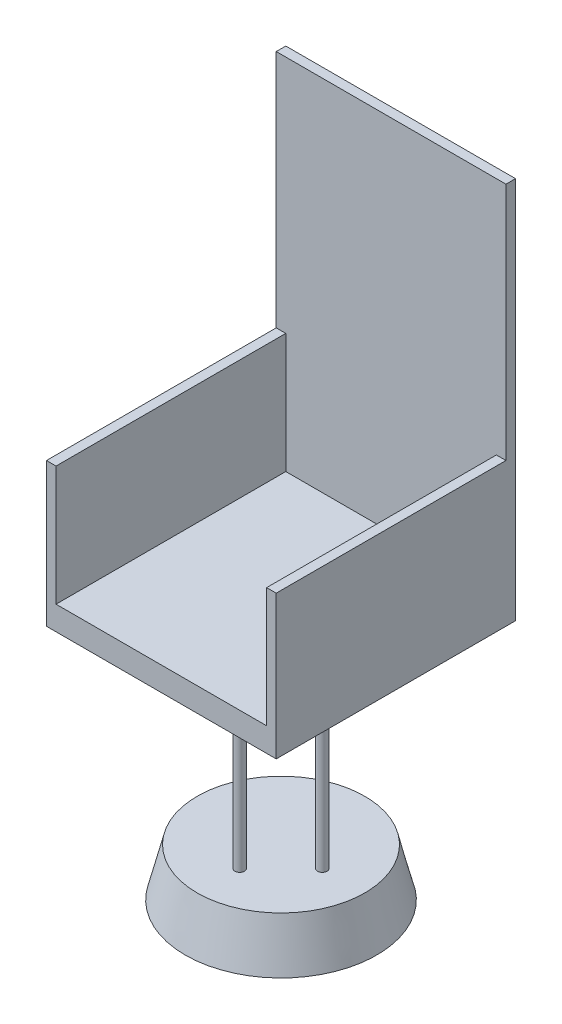
ISO-10303-21;
HEADER;
FILE_DESCRIPTION(('STEP AP214'),'2;1');
FILE_NAME('part.step','',(''),(''),'','','');
FILE_SCHEMA(('AUTOMOTIVE_DESIGN { 1 0 10303 214 1 1 1 1 }'));
ENDSEC;
DATA;
#1=APPLICATION_CONTEXT('core data for automotive mechanical design processes');
#2=APPLICATION_PROTOCOL_DEFINITION('international standard','automotive_design',2000,#1);
#3=PRODUCT_CONTEXT('',#1,'mechanical');
#4=PRODUCT('Part','Part','',(#3));
#5=PRODUCT_RELATED_PRODUCT_CATEGORY('part','',(#4));
#6=PRODUCT_DEFINITION_FORMATION('','',#4);
#7=PRODUCT_DEFINITION_CONTEXT('part definition',#1,'design');
#8=PRODUCT_DEFINITION('design','',#6,#7);
#9=PRODUCT_DEFINITION_SHAPE('','',#8);
#10=(LENGTH_UNIT() NAMED_UNIT(*) SI_UNIT(.MILLI.,.METRE.));
#11=(NAMED_UNIT(*) PLANE_ANGLE_UNIT() SI_UNIT($,.RADIAN.));
#12=(NAMED_UNIT(*) SI_UNIT($,.STERADIAN.) SOLID_ANGLE_UNIT());
#13=UNCERTAINTY_MEASURE_WITH_UNIT(LENGTH_MEASURE(1.E-05),#10,'distance_accuracy_value','');
#14=(GEOMETRIC_REPRESENTATION_CONTEXT(3) GLOBAL_UNCERTAINTY_ASSIGNED_CONTEXT((#13)) GLOBAL_UNIT_ASSIGNED_CONTEXT((#10,
#11,#12)) REPRESENTATION_CONTEXT('',''));
#15=CARTESIAN_POINT('',(0.,0.,0.));
#16=DIRECTION('',(0.,0.,1.));
#17=DIRECTION('',(1.,0.,0.));
#18=AXIS2_PLACEMENT_3D('',#15,#16,#17);
#19=CARTESIAN_POINT('',(0.,550.,0.));
#20=DIRECTION('',(0.,1.,0.));
#21=DIRECTION('',(0.,0.,1.));
#22=AXIS2_PLACEMENT_3D('',#19,#20,#21);
#23=PLANE('',#22);
#24=DIRECTION('',(1.,0.,0.));
#25=VECTOR('',#24,1.);
#26=CARTESIAN_POINT('',(-240.,550.,250.));
#27=LINE('',#26,#25);
#28=CARTESIAN_POINT('',(-220.,550.,250.));
#29=VERTEX_POINT('',#28);
#30=CARTESIAN_POINT('',(220.,550.,250.));
#31=VERTEX_POINT('',#30);
#32=EDGE_CURVE('E201',#29,#31,#27,.T.);
#33=ORIENTED_EDGE('',*,*,#32,.T.);
#34=DIRECTION('',(0.,0.,1.));
#35=VECTOR('',#34,1.);
#36=CARTESIAN_POINT('',(220.,550.,-230.));
#37=LINE('',#36,#35);
#38=CARTESIAN_POINT('',(220.,550.,-230.));
#39=VERTEX_POINT('',#38);
#40=EDGE_CURVE('E65',#39,#31,#37,.T.);
#41=ORIENTED_EDGE('',*,*,#40,.F.);
#42=DIRECTION('',(1.,0.,0.));
#43=VECTOR('',#42,1.);
#44=CARTESIAN_POINT('',(-240.,550.,-230.));
#45=LINE('',#44,#43);
#46=CARTESIAN_POINT('',(-220.,550.,-230.));
#47=VERTEX_POINT('',#46);
#48=EDGE_CURVE('E174',#47,#39,#45,.T.);
#49=ORIENTED_EDGE('',*,*,#48,.F.);
#50=DIRECTION('',(0.,0.,-1.));
#51=VECTOR('',#50,1.);
#52=CARTESIAN_POINT('',(-220.,550.,-230.));
#53=LINE('',#52,#51);
#54=EDGE_CURVE('E150',#29,#47,#53,.T.);
#55=ORIENTED_EDGE('',*,*,#54,.F.);
#56=EDGE_LOOP('',(#33,#41,#49,#55));
#57=FACE_BOUND('',#56,.T.);
#58=ADVANCED_FACE('F41',(#57),#23,.T.);
#59=CARTESIAN_POINT('',(-240.,1300.,-230.));
#60=DIRECTION('',(0.,0.,-1.));
#61=DIRECTION('',(-1.,0.,0.));
#62=AXIS2_PLACEMENT_3D('',#59,#60,#61);
#63=PLANE('',#62);
#64=DIRECTION('',(0.,-1.,0.));
#65=VECTOR('',#64,1.);
#66=CARTESIAN_POINT('',(220.,800.,-230.));
#67=LINE('',#66,#65);
#68=CARTESIAN_POINT('',(220.,800.,-230.));
#69=VERTEX_POINT('',#68);
#70=EDGE_CURVE('E57',#69,#39,#67,.T.);
#71=ORIENTED_EDGE('',*,*,#70,.F.);
#72=DIRECTION('',(-1.,0.,0.));
#73=VECTOR('',#72,1.);
#74=CARTESIAN_POINT('',(240.,800.,-230.));
#75=LINE('',#74,#73);
#76=CARTESIAN_POINT('',(240.,800.,-230.));
#77=VERTEX_POINT('',#76);
#78=EDGE_CURVE('E127',#77,#69,#75,.T.);
#79=ORIENTED_EDGE('',*,*,#78,.F.);
#80=DIRECTION('',(0.,-1.,0.));
#81=VECTOR('',#80,1.);
#82=CARTESIAN_POINT('',(240.,1300.,-230.));
#83=LINE('',#82,#81);
#84=CARTESIAN_POINT('',(240.,1300.,-230.));
#85=VERTEX_POINT('',#84);
#86=EDGE_CURVE('E190',#85,#77,#83,.T.);
#87=ORIENTED_EDGE('',*,*,#86,.F.);
#88=DIRECTION('',(1.,0.,0.));
#89=VECTOR('',#88,1.);
#90=CARTESIAN_POINT('',(-240.,1300.,-230.));
#91=LINE('',#90,#89);
#92=CARTESIAN_POINT('',(-240.,1300.,-230.));
#93=VERTEX_POINT('',#92);
#94=EDGE_CURVE('E179',#93,#85,#91,.T.);
#95=ORIENTED_EDGE('',*,*,#94,.F.);
#96=DIRECTION('',(0.,-1.,0.));
#97=VECTOR('',#96,1.);
#98=CARTESIAN_POINT('',(-240.,1300.,-230.));
#99=LINE('',#98,#97);
#100=CARTESIAN_POINT('',(-240.,800.,-230.));
#101=VERTEX_POINT('',#100);
#102=EDGE_CURVE('E196',#93,#101,#99,.T.);
#103=ORIENTED_EDGE('',*,*,#102,.T.);
#104=DIRECTION('',(-1.,0.,0.));
#105=VECTOR('',#104,1.);
#106=CARTESIAN_POINT('',(-240.,800.,-230.));
#107=LINE('',#106,#105);
#108=CARTESIAN_POINT('',(-220.,800.,-230.));
#109=VERTEX_POINT('',#108);
#110=EDGE_CURVE('E162',#109,#101,#107,.T.);
#111=ORIENTED_EDGE('',*,*,#110,.F.);
#112=DIRECTION('',(0.,-1.,0.));
#113=VECTOR('',#112,1.);
#114=CARTESIAN_POINT('',(-220.,800.,-230.));
#115=LINE('',#114,#113);
#116=EDGE_CURVE('E165',#109,#47,#115,.T.);
#117=ORIENTED_EDGE('',*,*,#116,.T.);
#118=ORIENTED_EDGE('',*,*,#48,.T.);
#119=EDGE_LOOP('',(#71,#79,#87,#95,#103,#111,#117,#118));
#120=FACE_BOUND('',#119,.T.);
#121=ADVANCED_FACE('F280',(#120),#63,.F.);
#122=CARTESIAN_POINT('',(0.,0.,0.));
#123=DIRECTION('',(0.,-1.,0.));
#124=DIRECTION('',(0.,0.,1.));
#125=AXIS2_PLACEMENT_3D('',#122,#123,#124);
#126=CONICAL_SURFACE('',#125,200.,0.244346095279206);
#127=CARTESIAN_POINT('',(0.,100.,0.));
#128=DIRECTION('',(0.,1.,0.));
#129=DIRECTION('',(0.,0.,1.));
#130=AXIS2_PLACEMENT_3D('',#127,#128,#129);
#131=CIRCLE('',#130,175.067199715682);
#132=CARTESIAN_POINT('',(0.,100.,175.067199715682));
#133=VERTEX_POINT('',#132);
#134=EDGE_CURVE('E11',#133,#133,#131,.T.);
#135=ORIENTED_EDGE('',*,*,#134,.F.);
#136=EDGE_LOOP('',(#135));
#137=FACE_BOUND('',#136,.T.);
#138=CARTESIAN_POINT('',(0.,0.,0.));
#139=DIRECTION('',(0.,1.,0.));
#140=DIRECTION('',(0.,0.,1.));
#141=AXIS2_PLACEMENT_3D('',#138,#139,#140);
#142=CIRCLE('',#141,200.);
#143=CARTESIAN_POINT('',(0.,0.,200.));
#144=VERTEX_POINT('',#143);
#145=EDGE_CURVE('E50',#144,#144,#142,.T.);
#146=ORIENTED_EDGE('',*,*,#145,.T.);
#147=EDGE_LOOP('',(#146));
#148=FACE_BOUND('',#147,.T.);
#149=ADVANCED_FACE('F43',(#137,#148),#126,.T.);
#150=CARTESIAN_POINT('',(0.,100.,0.));
#151=DIRECTION('',(0.,1.,0.));
#152=DIRECTION('',(0.,0.,1.));
#153=AXIS2_PLACEMENT_3D('',#150,#151,#152);
#154=PLANE('',#153);
#155=CARTESIAN_POINT('',(9.04413302804904E-13,100.,-86.3447550416687));
#156=DIRECTION('',(0.,1.,0.));
#157=DIRECTION('',(0.,0.,1.));
#158=AXIS2_PLACEMENT_3D('',#155,#156,#157);
#159=CIRCLE('',#158,9.99999999999999);
#160=CARTESIAN_POINT('',(9.04413302804904E-13,100.,-76.3447550416687));
#161=VERTEX_POINT('',#160);
#162=EDGE_CURVE('E230',#161,#161,#159,.T.);
#163=ORIENTED_EDGE('',*,*,#162,.F.);
#164=EDGE_LOOP('',(#163));
#165=FACE_BOUND('',#164,.T.);
#166=CARTESIAN_POINT('',(-86.3447550416687,100.,-6.02942201869936E-13));
#167=DIRECTION('',(0.,1.,0.));
#168=DIRECTION('',(0.,0.,1.));
#169=AXIS2_PLACEMENT_3D('',#166,#167,#168);
#170=CIRCLE('',#169,9.99999999999999);
#171=CARTESIAN_POINT('',(-86.3447550416687,100.,9.99999999999938));
#172=VERTEX_POINT('',#171);
#173=EDGE_CURVE('E235',#172,#172,#170,.T.);
#174=ORIENTED_EDGE('',*,*,#173,.F.);
#175=EDGE_LOOP('',(#174));
#176=FACE_BOUND('',#175,.T.);
#177=CARTESIAN_POINT('',(-3.01471100934968E-13,100.,86.3447550416687));
#178=DIRECTION('',(0.,1.,0.));
#179=DIRECTION('',(0.,0.,1.));
#180=AXIS2_PLACEMENT_3D('',#177,#178,#179);
#181=CIRCLE('',#180,10.);
#182=CARTESIAN_POINT('',(-3.01471100934968E-13,100.,96.3447550416687));
#183=VERTEX_POINT('',#182);
#184=EDGE_CURVE('E243',#183,#183,#181,.T.);
#185=ORIENTED_EDGE('',*,*,#184,.F.);
#186=EDGE_LOOP('',(#185));
#187=FACE_BOUND('',#186,.T.);
#188=CARTESIAN_POINT('',(86.3447550416687,100.,0.));
#189=DIRECTION('',(0.,1.,0.));
#190=DIRECTION('',(0.,0.,1.));
#191=AXIS2_PLACEMENT_3D('',#188,#189,#190);
#192=CIRCLE('',#191,9.99999999999999);
#193=CARTESIAN_POINT('',(86.3447550416687,100.,9.99999999999999));
#194=VERTEX_POINT('',#193);
#195=EDGE_CURVE('E251',#194,#194,#192,.T.);
#196=ORIENTED_EDGE('',*,*,#195,.F.);
#197=EDGE_LOOP('',(#196));
#198=FACE_BOUND('',#197,.T.);
#199=ORIENTED_EDGE('',*,*,#134,.T.);
#200=EDGE_LOOP('',(#199));
#201=FACE_BOUND('',#200,.T.);
#202=ADVANCED_FACE('F269',(#165,#176,#187,#198,#201),#154,.T.);
#203=CARTESIAN_POINT('',(0.,0.,0.));
#204=DIRECTION('',(0.,1.,0.));
#205=DIRECTION('',(0.,0.,1.));
#206=AXIS2_PLACEMENT_3D('',#203,#204,#205);
#207=PLANE('',#206);
#208=ORIENTED_EDGE('',*,*,#145,.F.);
#209=EDGE_LOOP('',(#208));
#210=FACE_BOUND('',#209,.T.);
#211=ADVANCED_FACE('F266',(#210),#207,.F.);
#212=CARTESIAN_POINT('',(86.3447550416687,500.,0.));
#213=DIRECTION('',(0.,-1.,0.));
#214=DIRECTION('',(0.,0.,-1.));
#215=AXIS2_PLACEMENT_3D('',#212,#213,#214);
#216=CYLINDRICAL_SURFACE('',#215,9.99999999999999);
#217=CARTESIAN_POINT('',(86.3447550416687,500.,0.));
#218=DIRECTION('',(0.,1.,0.));
#219=DIRECTION('',(0.,0.,1.));
#220=AXIS2_PLACEMENT_3D('',#217,#218,#219);
#221=CIRCLE('',#220,9.99999999999999);
#222=CARTESIAN_POINT('',(86.3447550416687,500.,9.99999999999999));
#223=VERTEX_POINT('',#222);
#224=EDGE_CURVE('E255',#223,#223,#221,.T.);
#225=ORIENTED_EDGE('',*,*,#224,.F.);
#226=EDGE_LOOP('',(#225));
#227=FACE_BOUND('',#226,.T.);
#228=ORIENTED_EDGE('',*,*,#195,.T.);
#229=EDGE_LOOP('',(#228));
#230=FACE_BOUND('',#229,.T.);
#231=ADVANCED_FACE('F268',(#227,#230),#216,.T.);
#232=CARTESIAN_POINT('',(-3.01471100934968E-13,500.,86.3447550416687));
#233=DIRECTION('',(0.,-1.,0.));
#234=DIRECTION('',(0.,0.,-1.));
#235=AXIS2_PLACEMENT_3D('',#232,#233,#234);
#236=CYLINDRICAL_SURFACE('',#235,10.);
#237=CARTESIAN_POINT('',(-3.01471100934968E-13,500.,86.3447550416687));
#238=DIRECTION('',(0.,1.,0.));
#239=DIRECTION('',(0.,0.,1.));
#240=AXIS2_PLACEMENT_3D('',#237,#238,#239);
#241=CIRCLE('',#240,10.);
#242=CARTESIAN_POINT('',(-3.01471100934968E-13,500.,96.3447550416687));
#243=VERTEX_POINT('',#242);
#244=EDGE_CURVE('E247',#243,#243,#241,.T.);
#245=ORIENTED_EDGE('',*,*,#244,.F.);
#246=EDGE_LOOP('',(#245));
#247=FACE_BOUND('',#246,.T.);
#248=ORIENTED_EDGE('',*,*,#184,.T.);
#249=EDGE_LOOP('',(#248));
#250=FACE_BOUND('',#249,.T.);
#251=ADVANCED_FACE('F274',(#247,#250),#236,.T.);
#252=CARTESIAN_POINT('',(-86.3447550416687,500.,-6.02942201869936E-13));
#253=DIRECTION('',(0.,-1.,0.));
#254=DIRECTION('',(0.,0.,-1.));
#255=AXIS2_PLACEMENT_3D('',#252,#253,#254);
#256=CYLINDRICAL_SURFACE('',#255,9.99999999999999);
#257=CARTESIAN_POINT('',(-86.3447550416687,500.,-6.02942201869936E-13));
#258=DIRECTION('',(0.,1.,0.));
#259=DIRECTION('',(0.,0.,1.));
#260=AXIS2_PLACEMENT_3D('',#257,#258,#259);
#261=CIRCLE('',#260,9.99999999999999);
#262=CARTESIAN_POINT('',(-86.3447550416687,500.,9.99999999999938));
#263=VERTEX_POINT('',#262);
#264=EDGE_CURVE('E239',#263,#263,#261,.T.);
#265=ORIENTED_EDGE('',*,*,#264,.F.);
#266=EDGE_LOOP('',(#265));
#267=FACE_BOUND('',#266,.T.);
#268=ORIENTED_EDGE('',*,*,#173,.T.);
#269=EDGE_LOOP('',(#268));
#270=FACE_BOUND('',#269,.T.);
#271=ADVANCED_FACE('F310',(#267,#270),#256,.T.);
#272=CARTESIAN_POINT('',(9.04413302804904E-13,500.,-86.3447550416687));
#273=DIRECTION('',(0.,-1.,0.));
#274=DIRECTION('',(0.,0.,-1.));
#275=AXIS2_PLACEMENT_3D('',#272,#273,#274);
#276=CYLINDRICAL_SURFACE('',#275,9.99999999999999);
#277=CARTESIAN_POINT('',(9.04413302804904E-13,500.,-86.3447550416687));
#278=DIRECTION('',(0.,1.,0.));
#279=DIRECTION('',(0.,0.,1.));
#280=AXIS2_PLACEMENT_3D('',#277,#278,#279);
#281=CIRCLE('',#280,9.99999999999999);
#282=CARTESIAN_POINT('',(9.04413302804904E-13,500.,-76.3447550416687));
#283=VERTEX_POINT('',#282);
#284=EDGE_CURVE('E231',#283,#283,#281,.T.);
#285=ORIENTED_EDGE('',*,*,#284,.F.);
#286=EDGE_LOOP('',(#285));
#287=FACE_BOUND('',#286,.T.);
#288=ORIENTED_EDGE('',*,*,#162,.T.);
#289=EDGE_LOOP('',(#288));
#290=FACE_BOUND('',#289,.T.);
#291=ADVANCED_FACE('F306',(#287,#290),#276,.T.);
#292=CARTESIAN_POINT('',(240.,550.,-250.));
#293=DIRECTION('',(-1.,0.,0.));
#294=DIRECTION('',(0.,0.,1.));
#295=AXIS2_PLACEMENT_3D('',#292,#293,#294);
#296=PLANE('',#295);
#297=DIRECTION('',(0.,0.,-1.));
#298=VECTOR('',#297,1.);
#299=CARTESIAN_POINT('',(240.,500.,-250.));
#300=LINE('',#299,#298);
#301=CARTESIAN_POINT('',(240.,500.,250.));
#302=VERTEX_POINT('',#301);
#303=CARTESIAN_POINT('',(240.,500.,-250.));
#304=VERTEX_POINT('',#303);
#305=EDGE_CURVE('E200',#302,#304,#300,.T.);
#306=ORIENTED_EDGE('',*,*,#305,.T.);
#307=DIRECTION('',(0.,-1.,0.));
#308=VECTOR('',#307,1.);
#309=CARTESIAN_POINT('',(240.,550.,-250.));
#310=LINE('',#309,#308);
#311=CARTESIAN_POINT('',(240.,1300.,-250.));
#312=VERTEX_POINT('',#311);
#313=EDGE_CURVE('E226',#312,#304,#310,.T.);
#314=ORIENTED_EDGE('',*,*,#313,.F.);
#315=DIRECTION('',(0.,0.,-1.));
#316=VECTOR('',#315,1.);
#317=CARTESIAN_POINT('',(240.,1300.,-250.));
#318=LINE('',#317,#316);
#319=EDGE_CURVE('E182',#85,#312,#318,.T.);
#320=ORIENTED_EDGE('',*,*,#319,.F.);
#321=ORIENTED_EDGE('',*,*,#86,.T.);
#322=DIRECTION('',(0.,0.,-1.));
#323=VECTOR('',#322,1.);
#324=CARTESIAN_POINT('',(240.,800.,-230.));
#325=LINE('',#324,#323);
#326=CARTESIAN_POINT('',(240.,800.,250.));
#327=VERTEX_POINT('',#326);
#328=EDGE_CURVE('E146',#327,#77,#325,.T.);
#329=ORIENTED_EDGE('',*,*,#328,.F.);
#330=DIRECTION('',(0.,-1.,0.));
#331=VECTOR('',#330,1.);
#332=CARTESIAN_POINT('',(240.,550.,250.));
#333=LINE('',#332,#331);
#334=EDGE_CURVE('E140',#327,#302,#333,.T.);
#335=ORIENTED_EDGE('',*,*,#334,.T.);
#336=EDGE_LOOP('',(#306,#314,#320,#321,#329,#335));
#337=FACE_BOUND('',#336,.T.);
#338=ADVANCED_FACE('F302',(#337),#296,.F.);
#339=CARTESIAN_POINT('',(-240.,550.,-250.));
#340=DIRECTION('',(0.,0.,1.));
#341=DIRECTION('',(1.,0.,0.));
#342=AXIS2_PLACEMENT_3D('',#339,#340,#341);
#343=PLANE('',#342);
#344=DIRECTION('',(-1.,0.,0.));
#345=VECTOR('',#344,1.);
#346=CARTESIAN_POINT('',(-240.,500.,-250.));
#347=LINE('',#346,#345);
#348=CARTESIAN_POINT('',(-240.,500.,-250.));
#349=VERTEX_POINT('',#348);
#350=EDGE_CURVE('E208',#304,#349,#347,.T.);
#351=ORIENTED_EDGE('',*,*,#350,.T.);
#352=DIRECTION('',(0.,-1.,0.));
#353=VECTOR('',#352,1.);
#354=CARTESIAN_POINT('',(-240.,550.,-250.));
#355=LINE('',#354,#353);
#356=CARTESIAN_POINT('',(-240.,1300.,-250.));
#357=VERTEX_POINT('',#356);
#358=EDGE_CURVE('E222',#357,#349,#355,.T.);
#359=ORIENTED_EDGE('',*,*,#358,.F.);
#360=DIRECTION('',(-1.,0.,0.));
#361=VECTOR('',#360,1.);
#362=CARTESIAN_POINT('',(-240.,1300.,-250.));
#363=LINE('',#362,#361);
#364=EDGE_CURVE('E186',#312,#357,#363,.T.);
#365=ORIENTED_EDGE('',*,*,#364,.F.);
#366=ORIENTED_EDGE('',*,*,#313,.T.);
#367=EDGE_LOOP('',(#351,#359,#365,#366));
#368=FACE_BOUND('',#367,.T.);
#369=ADVANCED_FACE('F298',(#368),#343,.F.);
#370=CARTESIAN_POINT('',(-240.,550.,-250.));
#371=DIRECTION('',(1.,0.,0.));
#372=DIRECTION('',(0.,0.,-1.));
#373=AXIS2_PLACEMENT_3D('',#370,#371,#372);
#374=PLANE('',#373);
#375=DIRECTION('',(0.,-1.,0.));
#376=VECTOR('',#375,1.);
#377=CARTESIAN_POINT('',(-240.,550.,250.));
#378=LINE('',#377,#376);
#379=CARTESIAN_POINT('',(-240.,800.,250.));
#380=VERTEX_POINT('',#379);
#381=CARTESIAN_POINT('',(-240.,500.,250.));
#382=VERTEX_POINT('',#381);
#383=EDGE_CURVE('E218',#380,#382,#378,.T.);
#384=ORIENTED_EDGE('',*,*,#383,.F.);
#385=DIRECTION('',(0.,0.,1.));
#386=VECTOR('',#385,1.);
#387=CARTESIAN_POINT('',(-240.,800.,-230.));
#388=LINE('',#387,#386);
#389=EDGE_CURVE('E151',#101,#380,#388,.T.);
#390=ORIENTED_EDGE('',*,*,#389,.F.);
#391=ORIENTED_EDGE('',*,*,#102,.F.);
#392=DIRECTION('',(0.,0.,1.));
#393=VECTOR('',#392,1.);
#394=CARTESIAN_POINT('',(-240.,1300.,-250.));
#395=LINE('',#394,#393);
#396=EDGE_CURVE('E175',#357,#93,#395,.T.);
#397=ORIENTED_EDGE('',*,*,#396,.F.);
#398=ORIENTED_EDGE('',*,*,#358,.T.);
#399=DIRECTION('',(0.,0.,1.));
#400=VECTOR('',#399,1.);
#401=CARTESIAN_POINT('',(-240.,500.,-250.));
#402=LINE('',#401,#400);
#403=EDGE_CURVE('E211',#349,#382,#402,.T.);
#404=ORIENTED_EDGE('',*,*,#403,.T.);
#405=EDGE_LOOP('',(#384,#390,#391,#397,#398,#404));
#406=FACE_BOUND('',#405,.T.);
#407=ADVANCED_FACE('F295',(#406),#374,.F.);
#408=CARTESIAN_POINT('',(-240.,550.,250.));
#409=DIRECTION('',(0.,0.,-1.));
#410=DIRECTION('',(-1.,0.,0.));
#411=AXIS2_PLACEMENT_3D('',#408,#409,#410);
#412=PLANE('',#411);
#413=DIRECTION('',(1.,0.,0.));
#414=VECTOR('',#413,1.);
#415=CARTESIAN_POINT('',(-240.,500.,250.));
#416=LINE('',#415,#414);
#417=EDGE_CURVE('E204',#382,#302,#416,.T.);
#418=ORIENTED_EDGE('',*,*,#417,.T.);
#419=ORIENTED_EDGE('',*,*,#334,.F.);
#420=DIRECTION('',(1.,0.,0.));
#421=VECTOR('',#420,1.);
#422=CARTESIAN_POINT('',(240.,800.,250.));
#423=LINE('',#422,#421);
#424=CARTESIAN_POINT('',(220.,800.,250.));
#425=VERTEX_POINT('',#424);
#426=EDGE_CURVE('E125',#425,#327,#423,.T.);
#427=ORIENTED_EDGE('',*,*,#426,.F.);
#428=DIRECTION('',(0.,-1.,0.));
#429=VECTOR('',#428,1.);
#430=CARTESIAN_POINT('',(220.,800.,250.));
#431=LINE('',#430,#429);
#432=EDGE_CURVE('E132',#425,#31,#431,.T.);
#433=ORIENTED_EDGE('',*,*,#432,.T.);
#434=ORIENTED_EDGE('',*,*,#32,.F.);
#435=DIRECTION('',(0.,-1.,0.));
#436=VECTOR('',#435,1.);
#437=CARTESIAN_POINT('',(-220.,800.,250.));
#438=LINE('',#437,#436);
#439=CARTESIAN_POINT('',(-220.,800.,250.));
#440=VERTEX_POINT('',#439);
#441=EDGE_CURVE('E171',#440,#29,#438,.T.);
#442=ORIENTED_EDGE('',*,*,#441,.F.);
#443=DIRECTION('',(1.,0.,0.));
#444=VECTOR('',#443,1.);
#445=CARTESIAN_POINT('',(-240.,800.,250.));
#446=LINE('',#445,#444);
#447=EDGE_CURVE('E155',#380,#440,#446,.T.);
#448=ORIENTED_EDGE('',*,*,#447,.F.);
#449=ORIENTED_EDGE('',*,*,#383,.T.);
#450=EDGE_LOOP('',(#418,#419,#427,#433,#434,#442,#448,#449));
#451=FACE_BOUND('',#450,.T.);
#452=ADVANCED_FACE('F138',(#451),#412,.F.);
#453=CARTESIAN_POINT('',(0.,500.,0.));
#454=DIRECTION('',(0.,1.,0.));
#455=DIRECTION('',(0.,0.,1.));
#456=AXIS2_PLACEMENT_3D('',#453,#454,#455);
#457=PLANE('',#456);
#458=ORIENTED_EDGE('',*,*,#224,.T.);
#459=EDGE_LOOP('',(#458));
#460=FACE_BOUND('',#459,.T.);
#461=ORIENTED_EDGE('',*,*,#244,.T.);
#462=EDGE_LOOP('',(#461));
#463=FACE_BOUND('',#462,.T.);
#464=ORIENTED_EDGE('',*,*,#264,.T.);
#465=EDGE_LOOP('',(#464));
#466=FACE_BOUND('',#465,.T.);
#467=ORIENTED_EDGE('',*,*,#284,.T.);
#468=EDGE_LOOP('',(#467));
#469=FACE_BOUND('',#468,.T.);
#470=ORIENTED_EDGE('',*,*,#305,.F.);
#471=ORIENTED_EDGE('',*,*,#417,.F.);
#472=ORIENTED_EDGE('',*,*,#403,.F.);
#473=ORIENTED_EDGE('',*,*,#350,.F.);
#474=EDGE_LOOP('',(#470,#471,#472,#473));
#475=FACE_BOUND('',#474,.T.);
#476=ADVANCED_FACE('F288',(#460,#463,#466,#469,#475),#457,.F.);
#477=CARTESIAN_POINT('',(0.,1300.,0.));
#478=DIRECTION('',(0.,1.,0.));
#479=DIRECTION('',(0.,0.,1.));
#480=AXIS2_PLACEMENT_3D('',#477,#478,#479);
#481=PLANE('',#480);
#482=ORIENTED_EDGE('',*,*,#396,.T.);
#483=ORIENTED_EDGE('',*,*,#94,.T.);
#484=ORIENTED_EDGE('',*,*,#319,.T.);
#485=ORIENTED_EDGE('',*,*,#364,.T.);
#486=EDGE_LOOP('',(#482,#483,#484,#485));
#487=FACE_BOUND('',#486,.T.);
#488=ADVANCED_FACE('F291',(#487),#481,.T.);
#489=CARTESIAN_POINT('',(-220.,800.,-230.));
#490=DIRECTION('',(-1.,0.,0.));
#491=DIRECTION('',(0.,0.,1.));
#492=AXIS2_PLACEMENT_3D('',#489,#490,#491);
#493=PLANE('',#492);
#494=ORIENTED_EDGE('',*,*,#54,.T.);
#495=ORIENTED_EDGE('',*,*,#116,.F.);
#496=DIRECTION('',(0.,0.,-1.));
#497=VECTOR('',#496,1.);
#498=CARTESIAN_POINT('',(-220.,800.,-230.));
#499=LINE('',#498,#497);
#500=EDGE_CURVE('E158',#440,#109,#499,.T.);
#501=ORIENTED_EDGE('',*,*,#500,.F.);
#502=ORIENTED_EDGE('',*,*,#441,.T.);
#503=EDGE_LOOP('',(#494,#495,#501,#502));
#504=FACE_BOUND('',#503,.T.);
#505=ADVANCED_FACE('F386',(#504),#493,.F.);
#506=CARTESIAN_POINT('',(0.,800.,0.));
#507=DIRECTION('',(0.,1.,0.));
#508=DIRECTION('',(0.,0.,1.));
#509=AXIS2_PLACEMENT_3D('',#506,#507,#508);
#510=PLANE('',#509);
#511=ORIENTED_EDGE('',*,*,#389,.T.);
#512=ORIENTED_EDGE('',*,*,#447,.T.);
#513=ORIENTED_EDGE('',*,*,#500,.T.);
#514=ORIENTED_EDGE('',*,*,#110,.T.);
#515=EDGE_LOOP('',(#511,#512,#513,#514));
#516=FACE_BOUND('',#515,.T.);
#517=ADVANCED_FACE('F423',(#516),#510,.T.);
#518=CARTESIAN_POINT('',(220.,800.,-230.));
#519=DIRECTION('',(1.,0.,0.));
#520=DIRECTION('',(0.,0.,-1.));
#521=AXIS2_PLACEMENT_3D('',#518,#519,#520);
#522=PLANE('',#521);
#523=ORIENTED_EDGE('',*,*,#40,.T.);
#524=ORIENTED_EDGE('',*,*,#432,.F.);
#525=DIRECTION('',(0.,0.,1.));
#526=VECTOR('',#525,1.);
#527=CARTESIAN_POINT('',(220.,800.,-230.));
#528=LINE('',#527,#526);
#529=EDGE_CURVE('E120',#69,#425,#528,.T.);
#530=ORIENTED_EDGE('',*,*,#529,.F.);
#531=ORIENTED_EDGE('',*,*,#70,.T.);
#532=EDGE_LOOP('',(#523,#524,#530,#531));
#533=FACE_BOUND('',#532,.T.);
#534=ADVANCED_FACE('F133',(#533),#522,.F.);
#535=CARTESIAN_POINT('',(0.,800.,0.));
#536=DIRECTION('',(0.,-1.,0.));
#537=DIRECTION('',(0.,0.,-1.));
#538=AXIS2_PLACEMENT_3D('',#535,#536,#537);
#539=PLANE('',#538);
#540=ORIENTED_EDGE('',*,*,#328,.T.);
#541=ORIENTED_EDGE('',*,*,#78,.T.);
#542=ORIENTED_EDGE('',*,*,#529,.T.);
#543=ORIENTED_EDGE('',*,*,#426,.T.);
#544=EDGE_LOOP('',(#540,#541,#542,#543));
#545=FACE_BOUND('',#544,.T.);
#546=ADVANCED_FACE('F123',(#545),#539,.F.);
#547=CLOSED_SHELL('',(#58,#121,#149,#202,#211,#231,#251,#271,#291,#338,#369,#407,#452,#476,#488,
#505,#517,#534,#546));
#548=MANIFOLD_SOLID_BREP('B2',#547);
#549=ADVANCED_BREP_SHAPE_REPRESENTATION('',(#18,#548),#14);
#550=SHAPE_DEFINITION_REPRESENTATION(#9,#549);
ENDSEC;
END-ISO-10303-21;
